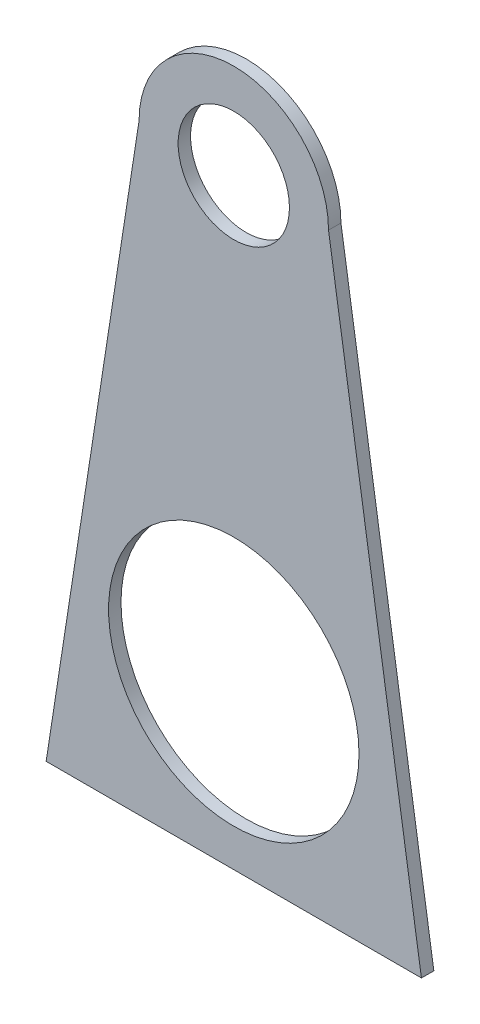
ISO-10303-21;
HEADER;
FILE_DESCRIPTION(('STEP AP214'),'2;1');
FILE_NAME('part.step','',(''),(''),'','','');
FILE_SCHEMA(('AUTOMOTIVE_DESIGN { 1 0 10303 214 1 1 1 1 }'));
ENDSEC;
DATA;
#1=APPLICATION_CONTEXT('core data for automotive mechanical design processes');
#2=APPLICATION_PROTOCOL_DEFINITION('international standard','automotive_design',2000,#1);
#3=PRODUCT_CONTEXT('',#1,'mechanical');
#4=PRODUCT('Part','Part','',(#3));
#5=PRODUCT_RELATED_PRODUCT_CATEGORY('part','',(#4));
#6=PRODUCT_DEFINITION_FORMATION('','',#4);
#7=PRODUCT_DEFINITION_CONTEXT('part definition',#1,'design');
#8=PRODUCT_DEFINITION('design','',#6,#7);
#9=PRODUCT_DEFINITION_SHAPE('','',#8);
#10=(LENGTH_UNIT() NAMED_UNIT(*) SI_UNIT(.MILLI.,.METRE.));
#11=(NAMED_UNIT(*) PLANE_ANGLE_UNIT() SI_UNIT($,.RADIAN.));
#12=(NAMED_UNIT(*) SI_UNIT($,.STERADIAN.) SOLID_ANGLE_UNIT());
#13=UNCERTAINTY_MEASURE_WITH_UNIT(LENGTH_MEASURE(1.E-05),#10,'distance_accuracy_value','');
#14=(GEOMETRIC_REPRESENTATION_CONTEXT(3) GLOBAL_UNCERTAINTY_ASSIGNED_CONTEXT((#13)) GLOBAL_UNIT_ASSIGNED_CONTEXT((#10,
#11,#12)) REPRESENTATION_CONTEXT('',''));
#15=CARTESIAN_POINT('',(0.,0.,0.));
#16=DIRECTION('',(0.,0.,1.));
#17=DIRECTION('',(1.,0.,0.));
#18=AXIS2_PLACEMENT_3D('',#15,#16,#17);
#19=CARTESIAN_POINT('',(0.,0.,3.175));
#20=DIRECTION('',(0.,0.,-1.));
#21=DIRECTION('',(-1.,0.,0.));
#22=AXIS2_PLACEMENT_3D('',#19,#20,#21);
#23=PLANE('',#22);
#24=CARTESIAN_POINT('',(0.,-112.056738627423,3.175));
#25=DIRECTION('',(0.,0.,1.));
#26=DIRECTION('',(1.,0.,0.));
#27=AXIS2_PLACEMENT_3D('',#24,#25,#26);
#28=CIRCLE('',#27,32.004);
#29=CARTESIAN_POINT('',(32.004,-112.056738627423,3.175));
#30=VERTEX_POINT('',#29);
#31=EDGE_CURVE('E120',#30,#30,#28,.T.);
#32=ORIENTED_EDGE('',*,*,#31,.F.);
#33=EDGE_LOOP('',(#32));
#34=FACE_BOUND('',#33,.T.);
#35=CARTESIAN_POINT('',(0.,0.,3.175));
#36=DIRECTION('',(0.,0.,1.));
#37=DIRECTION('',(-1.,0.,0.));
#38=AXIS2_PLACEMENT_3D('',#35,#36,#37);
#39=CIRCLE('',#38,24.2160661157025);
#40=CARTESIAN_POINT('',(24.2160661157025,0.,3.175));
#41=VERTEX_POINT('',#40);
#42=CARTESIAN_POINT('',(-24.2160661157025,0.,3.175));
#43=VERTEX_POINT('',#42);
#44=EDGE_CURVE('E85',#41,#43,#39,.T.);
#45=ORIENTED_EDGE('',*,*,#44,.T.);
#46=DIRECTION('',(-0.15270679966194,-0.988271538261124,0.));
#47=VECTOR('',#46,1.);
#48=CARTESIAN_POINT('',(-47.9610117055955,-153.67,3.175));
#49=LINE('',#48,#47);
#50=CARTESIAN_POINT('',(-47.9610117055955,-153.67,3.175));
#51=VERTEX_POINT('',#50);
#52=EDGE_CURVE('E80',#43,#51,#49,.T.);
#53=ORIENTED_EDGE('',*,*,#52,.T.);
#54=DIRECTION('',(1.,0.,0.));
#55=VECTOR('',#54,1.);
#56=CARTESIAN_POINT('',(47.9610117055956,-153.67,3.175));
#57=LINE('',#56,#55);
#58=CARTESIAN_POINT('',(47.9610117055956,-153.67,3.175));
#59=VERTEX_POINT('',#58);
#60=EDGE_CURVE('E83',#51,#59,#57,.T.);
#61=ORIENTED_EDGE('',*,*,#60,.T.);
#62=DIRECTION('',(-0.15270679966194,0.988271538261124,0.));
#63=VECTOR('',#62,1.);
#64=CARTESIAN_POINT('',(24.2160661157025,0.,3.175));
#65=LINE('',#64,#63);
#66=EDGE_CURVE('E50',#59,#41,#65,.T.);
#67=ORIENTED_EDGE('',*,*,#66,.T.);
#68=EDGE_LOOP('',(#45,#53,#61,#67));
#69=FACE_BOUND('',#68,.T.);
#70=CARTESIAN_POINT('',(0.,0.,3.175));
#71=DIRECTION('',(0.,0.,1.));
#72=DIRECTION('',(1.,0.,0.));
#73=AXIS2_PLACEMENT_3D('',#70,#71,#72);
#74=CIRCLE('',#73,14.224);
#75=CARTESIAN_POINT('',(14.224,0.,3.175));
#76=VERTEX_POINT('',#75);
#77=EDGE_CURVE('E100',#76,#76,#74,.T.);
#78=ORIENTED_EDGE('',*,*,#77,.F.);
#79=EDGE_LOOP('',(#78));
#80=FACE_BOUND('',#79,.T.);
#81=ADVANCED_FACE('F33',(#34,#69,#80),#23,.F.);
#82=CARTESIAN_POINT('',(0.,0.,0.));
#83=DIRECTION('',(0.,0.,-1.));
#84=DIRECTION('',(-1.,0.,0.));
#85=AXIS2_PLACEMENT_3D('',#82,#83,#84);
#86=PLANE('',#85);
#87=CARTESIAN_POINT('',(0.,-112.056738627423,0.));
#88=DIRECTION('',(0.,0.,-1.));
#89=DIRECTION('',(-1.,0.,0.));
#90=AXIS2_PLACEMENT_3D('',#87,#88,#89);
#91=CIRCLE('',#90,32.004);
#92=CARTESIAN_POINT('',(-32.004,-112.056738627423,0.));
#93=VERTEX_POINT('',#92);
#94=EDGE_CURVE('E115',#93,#93,#91,.F.);
#95=ORIENTED_EDGE('',*,*,#94,.T.);
#96=EDGE_LOOP('',(#95));
#97=FACE_BOUND('',#96,.T.);
#98=CARTESIAN_POINT('',(0.,0.,0.));
#99=DIRECTION('',(0.,0.,1.));
#100=DIRECTION('',(-1.,0.,0.));
#101=AXIS2_PLACEMENT_3D('',#98,#99,#100);
#102=CIRCLE('',#101,24.2160661157025);
#103=CARTESIAN_POINT('',(24.2160661157025,0.,0.));
#104=VERTEX_POINT('',#103);
#105=CARTESIAN_POINT('',(-24.2160661157025,0.,0.));
#106=VERTEX_POINT('',#105);
#107=EDGE_CURVE('E97',#104,#106,#102,.T.);
#108=ORIENTED_EDGE('',*,*,#107,.F.);
#109=DIRECTION('',(-0.15270679966194,0.988271538261124,0.));
#110=VECTOR('',#109,1.);
#111=CARTESIAN_POINT('',(24.2160661157025,0.,0.));
#112=LINE('',#111,#110);
#113=CARTESIAN_POINT('',(47.9610117055956,-153.67,0.));
#114=VERTEX_POINT('',#113);
#115=EDGE_CURVE('E73',#114,#104,#112,.T.);
#116=ORIENTED_EDGE('',*,*,#115,.F.);
#117=DIRECTION('',(1.,0.,0.));
#118=VECTOR('',#117,1.);
#119=CARTESIAN_POINT('',(47.9610117055956,-153.67,0.));
#120=LINE('',#119,#118);
#121=CARTESIAN_POINT('',(-47.9610117055955,-153.67,0.));
#122=VERTEX_POINT('',#121);
#123=EDGE_CURVE('E67',#122,#114,#120,.T.);
#124=ORIENTED_EDGE('',*,*,#123,.F.);
#125=DIRECTION('',(-0.15270679966194,-0.988271538261124,0.));
#126=VECTOR('',#125,1.);
#127=CARTESIAN_POINT('',(-47.9610117055955,-153.67,0.));
#128=LINE('',#127,#126);
#129=EDGE_CURVE('E89',#106,#122,#128,.T.);
#130=ORIENTED_EDGE('',*,*,#129,.F.);
#131=EDGE_LOOP('',(#108,#116,#124,#130));
#132=FACE_BOUND('',#131,.T.);
#133=CARTESIAN_POINT('',(0.,0.,0.));
#134=DIRECTION('',(0.,0.,1.));
#135=DIRECTION('',(1.,0.,0.));
#136=AXIS2_PLACEMENT_3D('',#133,#134,#135);
#137=CIRCLE('',#136,14.224);
#138=CARTESIAN_POINT('',(14.224,0.,0.));
#139=VERTEX_POINT('',#138);
#140=EDGE_CURVE('E112',#139,#139,#137,.T.);
#141=ORIENTED_EDGE('',*,*,#140,.T.);
#142=EDGE_LOOP('',(#141));
#143=FACE_BOUND('',#142,.T.);
#144=ADVANCED_FACE('F108',(#97,#132,#143),#86,.T.);
#145=CARTESIAN_POINT('',(0.,0.,3.175));
#146=DIRECTION('',(0.,0.,-1.));
#147=DIRECTION('',(-1.,0.,0.));
#148=AXIS2_PLACEMENT_3D('',#145,#146,#147);
#149=CYLINDRICAL_SURFACE('',#148,24.2160661157025);
#150=ORIENTED_EDGE('',*,*,#107,.T.);
#151=DIRECTION('',(0.,0.,-1.));
#152=VECTOR('',#151,1.);
#153=CARTESIAN_POINT('',(-24.2160661157025,0.,3.175));
#154=LINE('',#153,#152);
#155=EDGE_CURVE('E11',#43,#106,#154,.T.);
#156=ORIENTED_EDGE('',*,*,#155,.F.);
#157=ORIENTED_EDGE('',*,*,#44,.F.);
#158=DIRECTION('',(0.,0.,-1.));
#159=VECTOR('',#158,1.);
#160=CARTESIAN_POINT('',(24.2160661157025,0.,3.175));
#161=LINE('',#160,#159);
#162=EDGE_CURVE('E93',#41,#104,#161,.T.);
#163=ORIENTED_EDGE('',*,*,#162,.T.);
#164=EDGE_LOOP('',(#150,#156,#157,#163));
#165=FACE_BOUND('',#164,.T.);
#166=ADVANCED_FACE('F35',(#165),#149,.T.);
#167=CARTESIAN_POINT('',(-47.9610117055955,-153.67,3.175));
#168=DIRECTION('',(0.988271538261124,-0.15270679966194,0.));
#169=DIRECTION('',(0.15270679966194,0.988271538261124,0.));
#170=AXIS2_PLACEMENT_3D('',#167,#168,#169);
#171=PLANE('',#170);
#172=ORIENTED_EDGE('',*,*,#129,.T.);
#173=DIRECTION('',(0.,0.,-1.));
#174=VECTOR('',#173,1.);
#175=CARTESIAN_POINT('',(-47.9610117055955,-153.67,3.175));
#176=LINE('',#175,#174);
#177=EDGE_CURVE('E42',#51,#122,#176,.T.);
#178=ORIENTED_EDGE('',*,*,#177,.F.);
#179=ORIENTED_EDGE('',*,*,#52,.F.);
#180=ORIENTED_EDGE('',*,*,#155,.T.);
#181=EDGE_LOOP('',(#172,#178,#179,#180));
#182=FACE_BOUND('',#181,.T.);
#183=ADVANCED_FACE('F88',(#182),#171,.F.);
#184=CARTESIAN_POINT('',(47.9610117055956,-153.67,3.175));
#185=DIRECTION('',(0.,1.,0.));
#186=DIRECTION('',(0.,0.,1.));
#187=AXIS2_PLACEMENT_3D('',#184,#185,#186);
#188=PLANE('',#187);
#189=ORIENTED_EDGE('',*,*,#123,.T.);
#190=DIRECTION('',(0.,0.,-1.));
#191=VECTOR('',#190,1.);
#192=CARTESIAN_POINT('',(47.9610117055956,-153.67,3.175));
#193=LINE('',#192,#191);
#194=EDGE_CURVE('E90',#59,#114,#193,.T.);
#195=ORIENTED_EDGE('',*,*,#194,.F.);
#196=ORIENTED_EDGE('',*,*,#60,.F.);
#197=ORIENTED_EDGE('',*,*,#177,.T.);
#198=EDGE_LOOP('',(#189,#195,#196,#197));
#199=FACE_BOUND('',#198,.T.);
#200=ADVANCED_FACE('F91',(#199),#188,.F.);
#201=CARTESIAN_POINT('',(24.2160661157025,0.,3.175));
#202=DIRECTION('',(-0.988271538261124,-0.15270679966194,0.));
#203=DIRECTION('',(0.15270679966194,-0.988271538261124,0.));
#204=AXIS2_PLACEMENT_3D('',#201,#202,#203);
#205=PLANE('',#204);
#206=ORIENTED_EDGE('',*,*,#115,.T.);
#207=ORIENTED_EDGE('',*,*,#162,.F.);
#208=ORIENTED_EDGE('',*,*,#66,.F.);
#209=ORIENTED_EDGE('',*,*,#194,.T.);
#210=EDGE_LOOP('',(#206,#207,#208,#209));
#211=FACE_BOUND('',#210,.T.);
#212=ADVANCED_FACE('F105',(#211),#205,.F.);
#213=CARTESIAN_POINT('',(0.,0.,3.175));
#214=DIRECTION('',(0.,0.,-1.));
#215=DIRECTION('',(-1.,0.,0.));
#216=AXIS2_PLACEMENT_3D('',#213,#214,#215);
#217=CYLINDRICAL_SURFACE('',#216,14.224);
#218=ORIENTED_EDGE('',*,*,#77,.T.);
#219=EDGE_LOOP('',(#218));
#220=FACE_BOUND('',#219,.T.);
#221=ORIENTED_EDGE('',*,*,#140,.F.);
#222=EDGE_LOOP('',(#221));
#223=FACE_BOUND('',#222,.T.);
#224=ADVANCED_FACE('F135',(#220,#223),#217,.F.);
#225=CARTESIAN_POINT('',(0.,-112.056738627423,-90.5209817003771));
#226=DIRECTION('',(0.,0.,1.));
#227=DIRECTION('',(1.,0.,0.));
#228=AXIS2_PLACEMENT_3D('',#225,#226,#227);
#229=CYLINDRICAL_SURFACE('',#228,32.004);
#230=ORIENTED_EDGE('',*,*,#31,.T.);
#231=EDGE_LOOP('',(#230));
#232=FACE_BOUND('',#231,.T.);
#233=ORIENTED_EDGE('',*,*,#94,.F.);
#234=EDGE_LOOP('',(#233));
#235=FACE_BOUND('',#234,.T.);
#236=ADVANCED_FACE('F124',(#232,#235),#229,.F.);
#237=CLOSED_SHELL('',(#81,#144,#166,#183,#200,#212,#224,#236));
#238=MANIFOLD_SOLID_BREP('B2',#237);
#239=ADVANCED_BREP_SHAPE_REPRESENTATION('',(#18,#238),#14);
#240=SHAPE_DEFINITION_REPRESENTATION(#9,#239);
ENDSEC;
END-ISO-10303-21;
